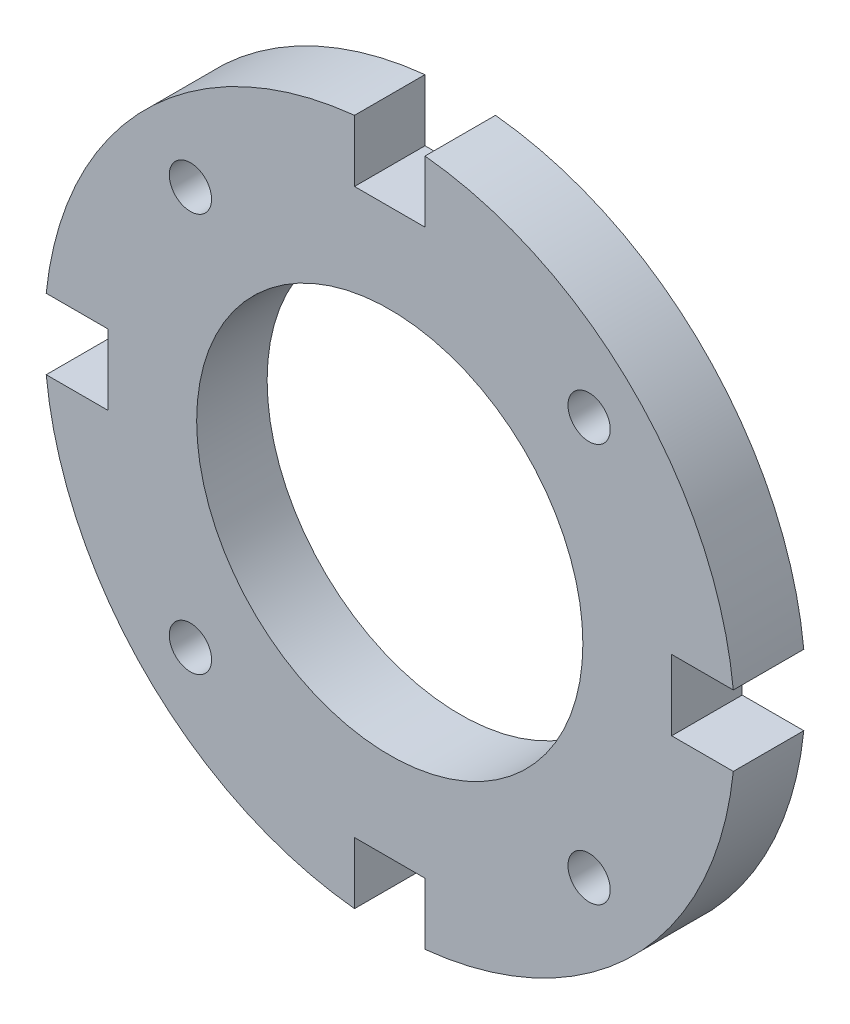
ISO-10303-21;
HEADER;
FILE_DESCRIPTION(('STEP AP214'),'2;1');
FILE_NAME('part.step','',(''),(''),'','','');
FILE_SCHEMA(('AUTOMOTIVE_DESIGN { 1 0 10303 214 1 1 1 1 }'));
ENDSEC;
DATA;
#1=APPLICATION_CONTEXT('core data for automotive mechanical design processes');
#2=APPLICATION_PROTOCOL_DEFINITION('international standard','automotive_design',2000,#1);
#3=PRODUCT_CONTEXT('',#1,'mechanical');
#4=PRODUCT('Part','Part','',(#3));
#5=PRODUCT_RELATED_PRODUCT_CATEGORY('part','',(#4));
#6=PRODUCT_DEFINITION_FORMATION('','',#4);
#7=PRODUCT_DEFINITION_CONTEXT('part definition',#1,'design');
#8=PRODUCT_DEFINITION('design','',#6,#7);
#9=PRODUCT_DEFINITION_SHAPE('','',#8);
#10=(LENGTH_UNIT() NAMED_UNIT(*) SI_UNIT(.MILLI.,.METRE.));
#11=(NAMED_UNIT(*) PLANE_ANGLE_UNIT() SI_UNIT($,.RADIAN.));
#12=(NAMED_UNIT(*) SI_UNIT($,.STERADIAN.) SOLID_ANGLE_UNIT());
#13=UNCERTAINTY_MEASURE_WITH_UNIT(LENGTH_MEASURE(1.E-05),#10,'distance_accuracy_value','');
#14=(GEOMETRIC_REPRESENTATION_CONTEXT(3) GLOBAL_UNCERTAINTY_ASSIGNED_CONTEXT((#13)) GLOBAL_UNIT_ASSIGNED_CONTEXT((#10,
#11,#12)) REPRESENTATION_CONTEXT('',''));
#15=CARTESIAN_POINT('',(0.,0.,0.));
#16=DIRECTION('',(0.,0.,1.));
#17=DIRECTION('',(1.,0.,0.));
#18=AXIS2_PLACEMENT_3D('',#15,#16,#17);
#19=CARTESIAN_POINT('',(0.,0.,5.));
#20=DIRECTION('',(0.,0.,1.));
#21=DIRECTION('',(1.,0.,0.));
#22=AXIS2_PLACEMENT_3D('',#19,#20,#21);
#23=PLANE('',#22);
#24=CARTESIAN_POINT('',(-14.1421356237309,14.142135623731,5.));
#25=DIRECTION('',(0.,0.,1.));
#26=DIRECTION('',(-1.,0.,0.));
#27=AXIS2_PLACEMENT_3D('',#24,#25,#26);
#28=CIRCLE('',#27,1.5);
#29=CARTESIAN_POINT('',(-15.6421356237309,14.142135623731,5.));
#30=VERTEX_POINT('',#29);
#31=EDGE_CURVE('E346',#30,#30,#28,.T.);
#32=ORIENTED_EDGE('',*,*,#31,.F.);
#33=EDGE_LOOP('',(#32));
#34=FACE_BOUND('',#33,.T.);
#35=CARTESIAN_POINT('',(14.1421356237309,14.142135623731,5.));
#36=DIRECTION('',(0.,0.,1.));
#37=DIRECTION('',(1.,0.,0.));
#38=AXIS2_PLACEMENT_3D('',#35,#36,#37);
#39=CIRCLE('',#38,1.5);
#40=CARTESIAN_POINT('',(15.6421356237309,14.142135623731,5.));
#41=VERTEX_POINT('',#40);
#42=EDGE_CURVE('E358',#41,#41,#39,.T.);
#43=ORIENTED_EDGE('',*,*,#42,.F.);
#44=EDGE_LOOP('',(#43));
#45=FACE_BOUND('',#44,.T.);
#46=CARTESIAN_POINT('',(0.,0.,5.));
#47=DIRECTION('',(0.,0.,1.));
#48=DIRECTION('',(1.,0.,0.));
#49=AXIS2_PLACEMENT_3D('',#46,#47,#48);
#50=CIRCLE('',#49,24.5000000000001);
#51=CARTESIAN_POINT('',(-2.5,24.3721152139079,5.));
#52=VERTEX_POINT('',#51);
#53=CARTESIAN_POINT('',(-24.3721152139079,2.49999999999999,5.));
#54=VERTEX_POINT('',#53);
#55=EDGE_CURVE('E208',#52,#54,#50,.T.);
#56=ORIENTED_EDGE('',*,*,#55,.T.);
#57=DIRECTION('',(1.,0.,0.));
#58=VECTOR('',#57,1.);
#59=CARTESIAN_POINT('',(-24.3721152139079,2.49999999999999,5.));
#60=LINE('',#59,#58);
#61=CARTESIAN_POINT('',(-20.,2.49999999999999,5.));
#62=VERTEX_POINT('',#61);
#63=EDGE_CURVE('E116',#54,#62,#60,.T.);
#64=ORIENTED_EDGE('',*,*,#63,.T.);
#65=DIRECTION('',(0.,-1.,0.));
#66=VECTOR('',#65,1.);
#67=CARTESIAN_POINT('',(-20.,2.49999999999999,5.));
#68=LINE('',#67,#66);
#69=CARTESIAN_POINT('',(-20.,-2.49999999999999,5.));
#70=VERTEX_POINT('',#69);
#71=EDGE_CURVE('E247',#62,#70,#68,.T.);
#72=ORIENTED_EDGE('',*,*,#71,.T.);
#73=DIRECTION('',(-1.,0.,0.));
#74=VECTOR('',#73,1.);
#75=CARTESIAN_POINT('',(-20.,-2.49999999999999,5.));
#76=LINE('',#75,#74);
#77=CARTESIAN_POINT('',(-24.3721152139079,-2.49999999999999,5.));
#78=VERTEX_POINT('',#77);
#79=EDGE_CURVE('E266',#70,#78,#76,.T.);
#80=ORIENTED_EDGE('',*,*,#79,.T.);
#81=CARTESIAN_POINT('',(0.,0.,5.));
#82=DIRECTION('',(0.,0.,1.));
#83=DIRECTION('',(1.,0.,0.));
#84=AXIS2_PLACEMENT_3D('',#81,#82,#83);
#85=CIRCLE('',#84,24.5);
#86=CARTESIAN_POINT('',(-2.50000000000001,-24.3721152139079,5.));
#87=VERTEX_POINT('',#86);
#88=EDGE_CURVE('E263',#78,#87,#85,.T.);
#89=ORIENTED_EDGE('',*,*,#88,.T.);
#90=DIRECTION('',(0.,1.,0.));
#91=VECTOR('',#90,1.);
#92=CARTESIAN_POINT('',(-2.5,-24.3721152139079,5.));
#93=LINE('',#92,#91);
#94=CARTESIAN_POINT('',(-2.5,-20.,5.));
#95=VERTEX_POINT('',#94);
#96=EDGE_CURVE('E265',#87,#95,#93,.T.);
#97=ORIENTED_EDGE('',*,*,#96,.T.);
#98=DIRECTION('',(1.,0.,0.));
#99=VECTOR('',#98,1.);
#100=CARTESIAN_POINT('',(-2.5,-20.,5.));
#101=LINE('',#100,#99);
#102=CARTESIAN_POINT('',(2.5,-20.,5.));
#103=VERTEX_POINT('',#102);
#104=EDGE_CURVE('E268',#95,#103,#101,.T.);
#105=ORIENTED_EDGE('',*,*,#104,.T.);
#106=DIRECTION('',(0.,-1.,0.));
#107=VECTOR('',#106,1.);
#108=CARTESIAN_POINT('',(2.5,-20.,5.));
#109=LINE('',#108,#107);
#110=CARTESIAN_POINT('',(2.5,-24.3721152139079,5.));
#111=VERTEX_POINT('',#110);
#112=EDGE_CURVE('E274',#103,#111,#109,.T.);
#113=ORIENTED_EDGE('',*,*,#112,.T.);
#114=CARTESIAN_POINT('',(0.,0.,5.));
#115=DIRECTION('',(0.,0.,1.));
#116=DIRECTION('',(1.,0.,0.));
#117=AXIS2_PLACEMENT_3D('',#114,#115,#116);
#118=CIRCLE('',#117,24.5);
#119=CARTESIAN_POINT('',(24.3721152139079,-2.49999999999999,5.));
#120=VERTEX_POINT('',#119);
#121=EDGE_CURVE('E276',#111,#120,#118,.T.);
#122=ORIENTED_EDGE('',*,*,#121,.T.);
#123=DIRECTION('',(-1.,0.,0.));
#124=VECTOR('',#123,1.);
#125=CARTESIAN_POINT('',(20.,-2.49999999999999,5.));
#126=LINE('',#125,#124);
#127=CARTESIAN_POINT('',(20.,-2.49999999999999,5.));
#128=VERTEX_POINT('',#127);
#129=EDGE_CURVE('E278',#120,#128,#126,.T.);
#130=ORIENTED_EDGE('',*,*,#129,.T.);
#131=DIRECTION('',(0.,1.,0.));
#132=VECTOR('',#131,1.);
#133=CARTESIAN_POINT('',(20.,2.49999999999999,5.));
#134=LINE('',#133,#132);
#135=CARTESIAN_POINT('',(20.,2.49999999999999,5.));
#136=VERTEX_POINT('',#135);
#137=EDGE_CURVE('E280',#128,#136,#134,.T.);
#138=ORIENTED_EDGE('',*,*,#137,.T.);
#139=DIRECTION('',(1.,0.,0.));
#140=VECTOR('',#139,1.);
#141=CARTESIAN_POINT('',(24.3721152139079,2.49999999999999,5.));
#142=LINE('',#141,#140);
#143=CARTESIAN_POINT('',(24.3721152139079,2.49999999999999,5.));
#144=VERTEX_POINT('',#143);
#145=EDGE_CURVE('E282',#136,#144,#142,.T.);
#146=ORIENTED_EDGE('',*,*,#145,.T.);
#147=CARTESIAN_POINT('',(0.,0.,5.));
#148=DIRECTION('',(0.,0.,1.));
#149=DIRECTION('',(-1.,0.,0.));
#150=AXIS2_PLACEMENT_3D('',#147,#148,#149);
#151=CIRCLE('',#150,24.5);
#152=CARTESIAN_POINT('',(2.5,24.3721152139079,5.));
#153=VERTEX_POINT('',#152);
#154=EDGE_CURVE('E159',#144,#153,#151,.T.);
#155=ORIENTED_EDGE('',*,*,#154,.T.);
#156=DIRECTION('',(0.,-1.,0.));
#157=VECTOR('',#156,1.);
#158=CARTESIAN_POINT('',(2.5,24.3721152139079,5.));
#159=LINE('',#158,#157);
#160=CARTESIAN_POINT('',(2.5,20.,5.));
#161=VERTEX_POINT('',#160);
#162=EDGE_CURVE('E153',#153,#161,#159,.T.);
#163=ORIENTED_EDGE('',*,*,#162,.T.);
#164=DIRECTION('',(-1.,0.,0.));
#165=VECTOR('',#164,1.);
#166=CARTESIAN_POINT('',(2.5,20.,5.));
#167=LINE('',#166,#165);
#168=CARTESIAN_POINT('',(-2.5,20.,5.));
#169=VERTEX_POINT('',#168);
#170=EDGE_CURVE('E157',#161,#169,#167,.T.);
#171=ORIENTED_EDGE('',*,*,#170,.T.);
#172=DIRECTION('',(0.,1.,0.));
#173=VECTOR('',#172,1.);
#174=CARTESIAN_POINT('',(-2.5,20.,5.));
#175=LINE('',#174,#173);
#176=EDGE_CURVE('E49',#169,#52,#175,.T.);
#177=ORIENTED_EDGE('',*,*,#176,.T.);
#178=EDGE_LOOP('',(#56,#64,#72,#80,#89,#97,#105,#113,#122,#130,#138,#146,#155,#163,#171,#177));
#179=FACE_BOUND('',#178,.T.);
#180=CARTESIAN_POINT('',(0.,0.,5.));
#181=DIRECTION('',(0.,0.,1.));
#182=DIRECTION('',(1.,0.,0.));
#183=AXIS2_PLACEMENT_3D('',#180,#181,#182);
#184=CIRCLE('',#183,13.7);
#185=CARTESIAN_POINT('',(13.7,0.,5.));
#186=VERTEX_POINT('',#185);
#187=EDGE_CURVE('E181',#186,#186,#184,.T.);
#188=ORIENTED_EDGE('',*,*,#187,.F.);
#189=EDGE_LOOP('',(#188));
#190=FACE_BOUND('',#189,.T.);
#191=CARTESIAN_POINT('',(14.1421356237309,-14.142135623731,5.));
#192=DIRECTION('',(0.,0.,1.));
#193=DIRECTION('',(-1.,0.,0.));
#194=AXIS2_PLACEMENT_3D('',#191,#192,#193);
#195=CIRCLE('',#194,1.5);
#196=CARTESIAN_POINT('',(12.6421356237309,-14.142135623731,5.));
#197=VERTEX_POINT('',#196);
#198=EDGE_CURVE('E352',#197,#197,#195,.T.);
#199=ORIENTED_EDGE('',*,*,#198,.F.);
#200=EDGE_LOOP('',(#199));
#201=FACE_BOUND('',#200,.T.);
#202=CARTESIAN_POINT('',(-14.1421356237309,-14.142135623731,5.));
#203=DIRECTION('',(0.,0.,1.));
#204=DIRECTION('',(1.,0.,0.));
#205=AXIS2_PLACEMENT_3D('',#202,#203,#204);
#206=CIRCLE('',#205,1.5);
#207=CARTESIAN_POINT('',(-12.6421356237309,-14.142135623731,5.));
#208=VERTEX_POINT('',#207);
#209=EDGE_CURVE('E337',#208,#208,#206,.T.);
#210=ORIENTED_EDGE('',*,*,#209,.F.);
#211=EDGE_LOOP('',(#210));
#212=FACE_BOUND('',#211,.T.);
#213=ADVANCED_FACE('F32',(#34,#45,#179,#190,#201,#212),#23,.T.);
#214=CARTESIAN_POINT('',(0.,0.,0.));
#215=DIRECTION('',(0.,0.,1.));
#216=DIRECTION('',(1.,0.,0.));
#217=AXIS2_PLACEMENT_3D('',#214,#215,#216);
#218=PLANE('',#217);
#219=CARTESIAN_POINT('',(0.,0.,0.));
#220=DIRECTION('',(0.,0.,1.));
#221=DIRECTION('',(1.,0.,0.));
#222=AXIS2_PLACEMENT_3D('',#219,#220,#221);
#223=CIRCLE('',#222,24.5000000000001);
#224=CARTESIAN_POINT('',(-2.5,24.3721152139079,0.));
#225=VERTEX_POINT('',#224);
#226=CARTESIAN_POINT('',(-24.3721152139079,2.49999999999999,0.));
#227=VERTEX_POINT('',#226);
#228=EDGE_CURVE('E177',#225,#227,#223,.T.);
#229=ORIENTED_EDGE('',*,*,#228,.F.);
#230=DIRECTION('',(0.,1.,0.));
#231=VECTOR('',#230,1.);
#232=CARTESIAN_POINT('',(-2.5,20.,0.));
#233=LINE('',#232,#231);
#234=CARTESIAN_POINT('',(-2.5,20.,0.));
#235=VERTEX_POINT('',#234);
#236=EDGE_CURVE('E108',#235,#225,#233,.T.);
#237=ORIENTED_EDGE('',*,*,#236,.F.);
#238=DIRECTION('',(-1.,0.,0.));
#239=VECTOR('',#238,1.);
#240=CARTESIAN_POINT('',(2.5,20.,0.));
#241=LINE('',#240,#239);
#242=CARTESIAN_POINT('',(2.5,20.,0.));
#243=VERTEX_POINT('',#242);
#244=EDGE_CURVE('E102',#243,#235,#241,.T.);
#245=ORIENTED_EDGE('',*,*,#244,.F.);
#246=DIRECTION('',(0.,-1.,0.));
#247=VECTOR('',#246,1.);
#248=CARTESIAN_POINT('',(2.5,24.3721152139079,0.));
#249=LINE('',#248,#247);
#250=CARTESIAN_POINT('',(2.5,24.3721152139079,0.));
#251=VERTEX_POINT('',#250);
#252=EDGE_CURVE('E167',#251,#243,#249,.T.);
#253=ORIENTED_EDGE('',*,*,#252,.F.);
#254=CARTESIAN_POINT('',(0.,0.,0.));
#255=DIRECTION('',(0.,0.,1.));
#256=DIRECTION('',(-1.,0.,0.));
#257=AXIS2_PLACEMENT_3D('',#254,#255,#256);
#258=CIRCLE('',#257,24.5);
#259=CARTESIAN_POINT('',(24.3721152139079,2.49999999999999,0.));
#260=VERTEX_POINT('',#259);
#261=EDGE_CURVE('E203',#260,#251,#258,.T.);
#262=ORIENTED_EDGE('',*,*,#261,.F.);
#263=DIRECTION('',(1.,0.,0.));
#264=VECTOR('',#263,1.);
#265=CARTESIAN_POINT('',(24.3721152139079,2.49999999999999,0.));
#266=LINE('',#265,#264);
#267=CARTESIAN_POINT('',(20.,2.49999999999999,0.));
#268=VERTEX_POINT('',#267);
#269=EDGE_CURVE('E201',#268,#260,#266,.T.);
#270=ORIENTED_EDGE('',*,*,#269,.F.);
#271=DIRECTION('',(0.,1.,0.));
#272=VECTOR('',#271,1.);
#273=CARTESIAN_POINT('',(20.,2.49999999999999,0.));
#274=LINE('',#273,#272);
#275=CARTESIAN_POINT('',(20.,-2.49999999999999,0.));
#276=VERTEX_POINT('',#275);
#277=EDGE_CURVE('E199',#276,#268,#274,.T.);
#278=ORIENTED_EDGE('',*,*,#277,.F.);
#279=DIRECTION('',(-1.,0.,0.));
#280=VECTOR('',#279,1.);
#281=CARTESIAN_POINT('',(20.,-2.49999999999999,0.));
#282=LINE('',#281,#280);
#283=CARTESIAN_POINT('',(24.3721152139079,-2.49999999999999,0.));
#284=VERTEX_POINT('',#283);
#285=EDGE_CURVE('E197',#284,#276,#282,.T.);
#286=ORIENTED_EDGE('',*,*,#285,.F.);
#287=CARTESIAN_POINT('',(0.,0.,0.));
#288=DIRECTION('',(0.,0.,1.));
#289=DIRECTION('',(1.,0.,0.));
#290=AXIS2_PLACEMENT_3D('',#287,#288,#289);
#291=CIRCLE('',#290,24.5);
#292=CARTESIAN_POINT('',(2.5,-24.3721152139079,0.));
#293=VERTEX_POINT('',#292);
#294=EDGE_CURVE('E195',#293,#284,#291,.T.);
#295=ORIENTED_EDGE('',*,*,#294,.F.);
#296=DIRECTION('',(0.,-1.,0.));
#297=VECTOR('',#296,1.);
#298=CARTESIAN_POINT('',(2.5,-20.,0.));
#299=LINE('',#298,#297);
#300=CARTESIAN_POINT('',(2.5,-20.,0.));
#301=VERTEX_POINT('',#300);
#302=EDGE_CURVE('E193',#301,#293,#299,.T.);
#303=ORIENTED_EDGE('',*,*,#302,.F.);
#304=DIRECTION('',(1.,0.,0.));
#305=VECTOR('',#304,1.);
#306=CARTESIAN_POINT('',(-2.5,-20.,0.));
#307=LINE('',#306,#305);
#308=CARTESIAN_POINT('',(-2.5,-20.,0.));
#309=VERTEX_POINT('',#308);
#310=EDGE_CURVE('E191',#309,#301,#307,.T.);
#311=ORIENTED_EDGE('',*,*,#310,.F.);
#312=DIRECTION('',(0.,1.,0.));
#313=VECTOR('',#312,1.);
#314=CARTESIAN_POINT('',(-2.5,-24.3721152139079,0.));
#315=LINE('',#314,#313);
#316=CARTESIAN_POINT('',(-2.50000000000001,-24.3721152139079,0.));
#317=VERTEX_POINT('',#316);
#318=EDGE_CURVE('E189',#317,#309,#315,.T.);
#319=ORIENTED_EDGE('',*,*,#318,.F.);
#320=CARTESIAN_POINT('',(0.,0.,0.));
#321=DIRECTION('',(0.,0.,1.));
#322=DIRECTION('',(1.,0.,0.));
#323=AXIS2_PLACEMENT_3D('',#320,#321,#322);
#324=CIRCLE('',#323,24.5);
#325=CARTESIAN_POINT('',(-24.3721152139079,-2.49999999999999,0.));
#326=VERTEX_POINT('',#325);
#327=EDGE_CURVE('E187',#326,#317,#324,.T.);
#328=ORIENTED_EDGE('',*,*,#327,.F.);
#329=DIRECTION('',(-1.,0.,0.));
#330=VECTOR('',#329,1.);
#331=CARTESIAN_POINT('',(-20.,-2.49999999999999,0.));
#332=LINE('',#331,#330);
#333=CARTESIAN_POINT('',(-20.,-2.49999999999999,0.));
#334=VERTEX_POINT('',#333);
#335=EDGE_CURVE('E185',#334,#326,#332,.T.);
#336=ORIENTED_EDGE('',*,*,#335,.F.);
#337=DIRECTION('',(0.,-1.,0.));
#338=VECTOR('',#337,1.);
#339=CARTESIAN_POINT('',(-20.,2.49999999999999,0.));
#340=LINE('',#339,#338);
#341=CARTESIAN_POINT('',(-20.,2.49999999999999,0.));
#342=VERTEX_POINT('',#341);
#343=EDGE_CURVE('E183',#342,#334,#340,.T.);
#344=ORIENTED_EDGE('',*,*,#343,.F.);
#345=DIRECTION('',(1.,0.,0.));
#346=VECTOR('',#345,1.);
#347=CARTESIAN_POINT('',(-24.3721152139079,2.49999999999999,0.));
#348=LINE('',#347,#346);
#349=EDGE_CURVE('E180',#227,#342,#348,.T.);
#350=ORIENTED_EDGE('',*,*,#349,.F.);
#351=EDGE_LOOP('',(#229,#237,#245,#253,#262,#270,#278,#286,#295,#303,#311,#319,#328,#336,#344,#350));
#352=FACE_BOUND('',#351,.T.);
#353=CARTESIAN_POINT('',(0.,0.,0.));
#354=DIRECTION('',(0.,0.,1.));
#355=DIRECTION('',(1.,0.,0.));
#356=AXIS2_PLACEMENT_3D('',#353,#354,#355);
#357=CIRCLE('',#356,13.7);
#358=CARTESIAN_POINT('',(13.7,0.,0.));
#359=VERTEX_POINT('',#358);
#360=EDGE_CURVE('E361',#359,#359,#357,.T.);
#361=ORIENTED_EDGE('',*,*,#360,.T.);
#362=EDGE_LOOP('',(#361));
#363=FACE_BOUND('',#362,.T.);
#364=CARTESIAN_POINT('',(14.1421356237309,14.142135623731,0.));
#365=DIRECTION('',(0.,0.,1.));
#366=DIRECTION('',(1.,0.,0.));
#367=AXIS2_PLACEMENT_3D('',#364,#365,#366);
#368=CIRCLE('',#367,1.5);
#369=CARTESIAN_POINT('',(15.6421356237309,14.142135623731,0.));
#370=VERTEX_POINT('',#369);
#371=EDGE_CURVE('E355',#370,#370,#368,.T.);
#372=ORIENTED_EDGE('',*,*,#371,.T.);
#373=EDGE_LOOP('',(#372));
#374=FACE_BOUND('',#373,.T.);
#375=CARTESIAN_POINT('',(14.1421356237309,-14.142135623731,0.));
#376=DIRECTION('',(0.,0.,1.));
#377=DIRECTION('',(-1.,0.,0.));
#378=AXIS2_PLACEMENT_3D('',#375,#376,#377);
#379=CIRCLE('',#378,1.5);
#380=CARTESIAN_POINT('',(12.6421356237309,-14.142135623731,0.));
#381=VERTEX_POINT('',#380);
#382=EDGE_CURVE('E349',#381,#381,#379,.T.);
#383=ORIENTED_EDGE('',*,*,#382,.T.);
#384=EDGE_LOOP('',(#383));
#385=FACE_BOUND('',#384,.T.);
#386=CARTESIAN_POINT('',(-14.1421356237309,14.142135623731,0.));
#387=DIRECTION('',(0.,0.,1.));
#388=DIRECTION('',(-1.,0.,0.));
#389=AXIS2_PLACEMENT_3D('',#386,#387,#388);
#390=CIRCLE('',#389,1.5);
#391=CARTESIAN_POINT('',(-15.6421356237309,14.142135623731,0.));
#392=VERTEX_POINT('',#391);
#393=EDGE_CURVE('E343',#392,#392,#390,.T.);
#394=ORIENTED_EDGE('',*,*,#393,.T.);
#395=EDGE_LOOP('',(#394));
#396=FACE_BOUND('',#395,.T.);
#397=CARTESIAN_POINT('',(-14.1421356237309,-14.142135623731,0.));
#398=DIRECTION('',(0.,0.,1.));
#399=DIRECTION('',(1.,0.,0.));
#400=AXIS2_PLACEMENT_3D('',#397,#398,#399);
#401=CIRCLE('',#400,1.5);
#402=CARTESIAN_POINT('',(-12.6421356237309,-14.142135623731,0.));
#403=VERTEX_POINT('',#402);
#404=EDGE_CURVE('E340',#403,#403,#401,.T.);
#405=ORIENTED_EDGE('',*,*,#404,.T.);
#406=EDGE_LOOP('',(#405));
#407=FACE_BOUND('',#406,.T.);
#408=ADVANCED_FACE('F251',(#352,#363,#374,#385,#396,#407),#218,.F.);
#409=CARTESIAN_POINT('',(0.,0.,5.));
#410=DIRECTION('',(0.,0.,-1.));
#411=DIRECTION('',(-1.,0.,0.));
#412=AXIS2_PLACEMENT_3D('',#409,#410,#411);
#413=CYLINDRICAL_SURFACE('',#412,24.5000000000001);
#414=ORIENTED_EDGE('',*,*,#228,.T.);
#415=DIRECTION('',(0.,0.,-1.));
#416=VECTOR('',#415,1.);
#417=CARTESIAN_POINT('',(-24.3721152139079,2.49999999999999,5.));
#418=LINE('',#417,#416);
#419=EDGE_CURVE('E11',#54,#227,#418,.T.);
#420=ORIENTED_EDGE('',*,*,#419,.F.);
#421=ORIENTED_EDGE('',*,*,#55,.F.);
#422=DIRECTION('',(0.,0.,-1.));
#423=VECTOR('',#422,1.);
#424=CARTESIAN_POINT('',(-2.5,24.3721152139079,5.));
#425=LINE('',#424,#423);
#426=EDGE_CURVE('E173',#52,#225,#425,.T.);
#427=ORIENTED_EDGE('',*,*,#426,.T.);
#428=EDGE_LOOP('',(#414,#420,#421,#427));
#429=FACE_BOUND('',#428,.T.);
#430=ADVANCED_FACE('F34',(#429),#413,.T.);
#431=CARTESIAN_POINT('',(-24.3721152139079,2.49999999999999,5.));
#432=DIRECTION('',(0.,1.,0.));
#433=DIRECTION('',(-1.,0.,0.));
#434=AXIS2_PLACEMENT_3D('',#431,#432,#433);
#435=PLANE('',#434);
#436=ORIENTED_EDGE('',*,*,#349,.T.);
#437=DIRECTION('',(0.,0.,-1.));
#438=VECTOR('',#437,1.);
#439=CARTESIAN_POINT('',(-20.,2.49999999999999,5.));
#440=LINE('',#439,#438);
#441=EDGE_CURVE('E41',#62,#342,#440,.T.);
#442=ORIENTED_EDGE('',*,*,#441,.F.);
#443=ORIENTED_EDGE('',*,*,#63,.F.);
#444=ORIENTED_EDGE('',*,*,#419,.T.);
#445=EDGE_LOOP('',(#436,#442,#443,#444));
#446=FACE_BOUND('',#445,.T.);
#447=ADVANCED_FACE('F520',(#446),#435,.F.);
#448=CARTESIAN_POINT('',(-20.,2.49999999999999,5.));
#449=DIRECTION('',(1.,0.,0.));
#450=DIRECTION('',(0.,0.,-1.));
#451=AXIS2_PLACEMENT_3D('',#448,#449,#450);
#452=PLANE('',#451);
#453=ORIENTED_EDGE('',*,*,#343,.T.);
#454=DIRECTION('',(0.,0.,-1.));
#455=VECTOR('',#454,1.);
#456=CARTESIAN_POINT('',(-20.,-2.49999999999999,5.));
#457=LINE('',#456,#455);
#458=EDGE_CURVE('E239',#70,#334,#457,.T.);
#459=ORIENTED_EDGE('',*,*,#458,.F.);
#460=ORIENTED_EDGE('',*,*,#71,.F.);
#461=ORIENTED_EDGE('',*,*,#441,.T.);
#462=EDGE_LOOP('',(#453,#459,#460,#461));
#463=FACE_BOUND('',#462,.T.);
#464=ADVANCED_FACE('F245',(#463),#452,.F.);
#465=CARTESIAN_POINT('',(-20.,-2.49999999999999,5.));
#466=DIRECTION('',(0.,-1.,0.));
#467=DIRECTION('',(1.,0.,0.));
#468=AXIS2_PLACEMENT_3D('',#465,#466,#467);
#469=PLANE('',#468);
#470=ORIENTED_EDGE('',*,*,#335,.T.);
#471=DIRECTION('',(0.,0.,-1.));
#472=VECTOR('',#471,1.);
#473=CARTESIAN_POINT('',(-24.3721152139079,-2.49999999999999,5.));
#474=LINE('',#473,#472);
#475=EDGE_CURVE('E236',#78,#326,#474,.T.);
#476=ORIENTED_EDGE('',*,*,#475,.F.);
#477=ORIENTED_EDGE('',*,*,#79,.F.);
#478=ORIENTED_EDGE('',*,*,#458,.T.);
#479=EDGE_LOOP('',(#470,#476,#477,#478));
#480=FACE_BOUND('',#479,.T.);
#481=ADVANCED_FACE('F257',(#480),#469,.F.);
#482=CARTESIAN_POINT('',(0.,0.,5.));
#483=DIRECTION('',(0.,0.,-1.));
#484=DIRECTION('',(-1.,0.,0.));
#485=AXIS2_PLACEMENT_3D('',#482,#483,#484);
#486=CYLINDRICAL_SURFACE('',#485,24.5);
#487=ORIENTED_EDGE('',*,*,#327,.T.);
#488=DIRECTION('',(0.,0.,-1.));
#489=VECTOR('',#488,1.);
#490=CARTESIAN_POINT('',(-2.50000000000001,-24.3721152139079,5.));
#491=LINE('',#490,#489);
#492=EDGE_CURVE('E233',#87,#317,#491,.T.);
#493=ORIENTED_EDGE('',*,*,#492,.F.);
#494=ORIENTED_EDGE('',*,*,#88,.F.);
#495=ORIENTED_EDGE('',*,*,#475,.T.);
#496=EDGE_LOOP('',(#487,#493,#494,#495));
#497=FACE_BOUND('',#496,.T.);
#498=ADVANCED_FACE('F261',(#497),#486,.T.);
#499=CARTESIAN_POINT('',(-2.5,-24.3721152139079,5.));
#500=DIRECTION('',(-1.,0.,0.));
#501=DIRECTION('',(0.,-1.,0.));
#502=AXIS2_PLACEMENT_3D('',#499,#500,#501);
#503=PLANE('',#502);
#504=ORIENTED_EDGE('',*,*,#318,.T.);
#505=DIRECTION('',(0.,0.,-1.));
#506=VECTOR('',#505,1.);
#507=CARTESIAN_POINT('',(-2.5,-20.,5.));
#508=LINE('',#507,#506);
#509=EDGE_CURVE('E230',#95,#309,#508,.T.);
#510=ORIENTED_EDGE('',*,*,#509,.F.);
#511=ORIENTED_EDGE('',*,*,#96,.F.);
#512=ORIENTED_EDGE('',*,*,#492,.T.);
#513=EDGE_LOOP('',(#504,#510,#511,#512));
#514=FACE_BOUND('',#513,.T.);
#515=ADVANCED_FACE('F485',(#514),#503,.F.);
#516=CARTESIAN_POINT('',(-2.5,-20.,5.));
#517=DIRECTION('',(0.,1.,0.));
#518=DIRECTION('',(0.,0.,1.));
#519=AXIS2_PLACEMENT_3D('',#516,#517,#518);
#520=PLANE('',#519);
#521=ORIENTED_EDGE('',*,*,#310,.T.);
#522=DIRECTION('',(0.,0.,-1.));
#523=VECTOR('',#522,1.);
#524=CARTESIAN_POINT('',(2.5,-20.,5.));
#525=LINE('',#524,#523);
#526=EDGE_CURVE('E227',#103,#301,#525,.T.);
#527=ORIENTED_EDGE('',*,*,#526,.F.);
#528=ORIENTED_EDGE('',*,*,#104,.F.);
#529=ORIENTED_EDGE('',*,*,#509,.T.);
#530=EDGE_LOOP('',(#521,#527,#528,#529));
#531=FACE_BOUND('',#530,.T.);
#532=ADVANCED_FACE('F475',(#531),#520,.F.);
#533=CARTESIAN_POINT('',(2.5,-20.,5.));
#534=DIRECTION('',(1.,0.,0.));
#535=DIRECTION('',(0.,1.,0.));
#536=AXIS2_PLACEMENT_3D('',#533,#534,#535);
#537=PLANE('',#536);
#538=ORIENTED_EDGE('',*,*,#302,.T.);
#539=DIRECTION('',(0.,0.,-1.));
#540=VECTOR('',#539,1.);
#541=CARTESIAN_POINT('',(2.5,-24.3721152139079,5.));
#542=LINE('',#541,#540);
#543=EDGE_CURVE('E224',#111,#293,#542,.T.);
#544=ORIENTED_EDGE('',*,*,#543,.F.);
#545=ORIENTED_EDGE('',*,*,#112,.F.);
#546=ORIENTED_EDGE('',*,*,#526,.T.);
#547=EDGE_LOOP('',(#538,#544,#545,#546));
#548=FACE_BOUND('',#547,.T.);
#549=ADVANCED_FACE('F465',(#548),#537,.F.);
#550=CARTESIAN_POINT('',(0.,0.,5.));
#551=DIRECTION('',(0.,0.,-1.));
#552=DIRECTION('',(-1.,0.,0.));
#553=AXIS2_PLACEMENT_3D('',#550,#551,#552);
#554=CYLINDRICAL_SURFACE('',#553,24.5);
#555=ORIENTED_EDGE('',*,*,#294,.T.);
#556=DIRECTION('',(0.,0.,-1.));
#557=VECTOR('',#556,1.);
#558=CARTESIAN_POINT('',(24.3721152139079,-2.49999999999999,5.));
#559=LINE('',#558,#557);
#560=EDGE_CURVE('E221',#120,#284,#559,.T.);
#561=ORIENTED_EDGE('',*,*,#560,.F.);
#562=ORIENTED_EDGE('',*,*,#121,.F.);
#563=ORIENTED_EDGE('',*,*,#543,.T.);
#564=EDGE_LOOP('',(#555,#561,#562,#563));
#565=FACE_BOUND('',#564,.T.);
#566=ADVANCED_FACE('F455',(#565),#554,.T.);
#567=CARTESIAN_POINT('',(20.,-2.49999999999999,5.));
#568=DIRECTION('',(0.,-1.,0.));
#569=DIRECTION('',(1.,0.,0.));
#570=AXIS2_PLACEMENT_3D('',#567,#568,#569);
#571=PLANE('',#570);
#572=ORIENTED_EDGE('',*,*,#285,.T.);
#573=DIRECTION('',(0.,0.,-1.));
#574=VECTOR('',#573,1.);
#575=CARTESIAN_POINT('',(20.,-2.49999999999999,5.));
#576=LINE('',#575,#574);
#577=EDGE_CURVE('E218',#128,#276,#576,.T.);
#578=ORIENTED_EDGE('',*,*,#577,.F.);
#579=ORIENTED_EDGE('',*,*,#129,.F.);
#580=ORIENTED_EDGE('',*,*,#560,.T.);
#581=EDGE_LOOP('',(#572,#578,#579,#580));
#582=FACE_BOUND('',#581,.T.);
#583=ADVANCED_FACE('F445',(#582),#571,.F.);
#584=CARTESIAN_POINT('',(20.,2.49999999999999,5.));
#585=DIRECTION('',(-1.,0.,0.));
#586=DIRECTION('',(0.,0.,1.));
#587=AXIS2_PLACEMENT_3D('',#584,#585,#586);
#588=PLANE('',#587);
#589=ORIENTED_EDGE('',*,*,#277,.T.);
#590=DIRECTION('',(0.,0.,-1.));
#591=VECTOR('',#590,1.);
#592=CARTESIAN_POINT('',(20.,2.49999999999999,5.));
#593=LINE('',#592,#591);
#594=EDGE_CURVE('E215',#136,#268,#593,.T.);
#595=ORIENTED_EDGE('',*,*,#594,.F.);
#596=ORIENTED_EDGE('',*,*,#137,.F.);
#597=ORIENTED_EDGE('',*,*,#577,.T.);
#598=EDGE_LOOP('',(#589,#595,#596,#597));
#599=FACE_BOUND('',#598,.T.);
#600=ADVANCED_FACE('F436',(#599),#588,.F.);
#601=CARTESIAN_POINT('',(24.3721152139079,2.49999999999999,5.));
#602=DIRECTION('',(0.,1.,0.));
#603=DIRECTION('',(-1.,0.,0.));
#604=AXIS2_PLACEMENT_3D('',#601,#602,#603);
#605=PLANE('',#604);
#606=ORIENTED_EDGE('',*,*,#269,.T.);
#607=DIRECTION('',(0.,0.,-1.));
#608=VECTOR('',#607,1.);
#609=CARTESIAN_POINT('',(24.3721152139079,2.49999999999999,5.));
#610=LINE('',#609,#608);
#611=EDGE_CURVE('E212',#144,#260,#610,.T.);
#612=ORIENTED_EDGE('',*,*,#611,.F.);
#613=ORIENTED_EDGE('',*,*,#145,.F.);
#614=ORIENTED_EDGE('',*,*,#594,.T.);
#615=EDGE_LOOP('',(#606,#612,#613,#614));
#616=FACE_BOUND('',#615,.T.);
#617=ADVANCED_FACE('F288',(#616),#605,.F.);
#618=CARTESIAN_POINT('',(0.,0.,5.));
#619=DIRECTION('',(0.,0.,-1.));
#620=DIRECTION('',(-1.,0.,0.));
#621=AXIS2_PLACEMENT_3D('',#618,#619,#620);
#622=CYLINDRICAL_SURFACE('',#621,24.5);
#623=ORIENTED_EDGE('',*,*,#261,.T.);
#624=DIRECTION('',(0.,0.,-1.));
#625=VECTOR('',#624,1.);
#626=CARTESIAN_POINT('',(2.5,24.3721152139079,5.));
#627=LINE('',#626,#625);
#628=EDGE_CURVE('E168',#153,#251,#627,.T.);
#629=ORIENTED_EDGE('',*,*,#628,.F.);
#630=ORIENTED_EDGE('',*,*,#154,.F.);
#631=ORIENTED_EDGE('',*,*,#611,.T.);
#632=EDGE_LOOP('',(#623,#629,#630,#631));
#633=FACE_BOUND('',#632,.T.);
#634=ADVANCED_FACE('F292',(#633),#622,.T.);
#635=CARTESIAN_POINT('',(2.5,24.3721152139079,5.));
#636=DIRECTION('',(1.,0.,0.));
#637=DIRECTION('',(0.,1.,0.));
#638=AXIS2_PLACEMENT_3D('',#635,#636,#637);
#639=PLANE('',#638);
#640=ORIENTED_EDGE('',*,*,#252,.T.);
#641=DIRECTION('',(0.,0.,-1.));
#642=VECTOR('',#641,1.);
#643=CARTESIAN_POINT('',(2.5,20.,5.));
#644=LINE('',#643,#642);
#645=EDGE_CURVE('E164',#161,#243,#644,.T.);
#646=ORIENTED_EDGE('',*,*,#645,.F.);
#647=ORIENTED_EDGE('',*,*,#162,.F.);
#648=ORIENTED_EDGE('',*,*,#628,.T.);
#649=EDGE_LOOP('',(#640,#646,#647,#648));
#650=FACE_BOUND('',#649,.T.);
#651=ADVANCED_FACE('F165',(#650),#639,.F.);
#652=CARTESIAN_POINT('',(2.5,20.,5.));
#653=DIRECTION('',(0.,-1.,0.));
#654=DIRECTION('',(0.,0.,-1.));
#655=AXIS2_PLACEMENT_3D('',#652,#653,#654);
#656=PLANE('',#655);
#657=ORIENTED_EDGE('',*,*,#244,.T.);
#658=DIRECTION('',(0.,0.,-1.));
#659=VECTOR('',#658,1.);
#660=CARTESIAN_POINT('',(-2.5,20.,5.));
#661=LINE('',#660,#659);
#662=EDGE_CURVE('E169',#169,#235,#661,.T.);
#663=ORIENTED_EDGE('',*,*,#662,.F.);
#664=ORIENTED_EDGE('',*,*,#170,.F.);
#665=ORIENTED_EDGE('',*,*,#645,.T.);
#666=EDGE_LOOP('',(#657,#663,#664,#665));
#667=FACE_BOUND('',#666,.T.);
#668=ADVANCED_FACE('F171',(#667),#656,.F.);
#669=CARTESIAN_POINT('',(-2.5,20.,5.));
#670=DIRECTION('',(-1.,0.,0.));
#671=DIRECTION('',(0.,-1.,0.));
#672=AXIS2_PLACEMENT_3D('',#669,#670,#671);
#673=PLANE('',#672);
#674=ORIENTED_EDGE('',*,*,#236,.T.);
#675=ORIENTED_EDGE('',*,*,#426,.F.);
#676=ORIENTED_EDGE('',*,*,#176,.F.);
#677=ORIENTED_EDGE('',*,*,#662,.T.);
#678=EDGE_LOOP('',(#674,#675,#676,#677));
#679=FACE_BOUND('',#678,.T.);
#680=ADVANCED_FACE('F296',(#679),#673,.F.);
#681=CARTESIAN_POINT('',(0.,0.,5.));
#682=DIRECTION('',(0.,0.,-1.));
#683=DIRECTION('',(-1.,0.,0.));
#684=AXIS2_PLACEMENT_3D('',#681,#682,#683);
#685=CYLINDRICAL_SURFACE('',#684,13.7);
#686=ORIENTED_EDGE('',*,*,#187,.T.);
#687=EDGE_LOOP('',(#686));
#688=FACE_BOUND('',#687,.T.);
#689=ORIENTED_EDGE('',*,*,#360,.F.);
#690=EDGE_LOOP('',(#689));
#691=FACE_BOUND('',#690,.T.);
#692=ADVANCED_FACE('F298',(#688,#691),#685,.F.);
#693=CARTESIAN_POINT('',(14.1421356237309,14.142135623731,5.));
#694=DIRECTION('',(0.,0.,-1.));
#695=DIRECTION('',(-1.,0.,0.));
#696=AXIS2_PLACEMENT_3D('',#693,#694,#695);
#697=CYLINDRICAL_SURFACE('',#696,1.5);
#698=ORIENTED_EDGE('',*,*,#42,.T.);
#699=EDGE_LOOP('',(#698));
#700=FACE_BOUND('',#699,.T.);
#701=ORIENTED_EDGE('',*,*,#371,.F.);
#702=EDGE_LOOP('',(#701));
#703=FACE_BOUND('',#702,.T.);
#704=ADVANCED_FACE('F304',(#700,#703),#697,.F.);
#705=CARTESIAN_POINT('',(14.1421356237309,-14.142135623731,5.));
#706=DIRECTION('',(0.,0.,-1.));
#707=DIRECTION('',(-1.,0.,0.));
#708=AXIS2_PLACEMENT_3D('',#705,#706,#707);
#709=CYLINDRICAL_SURFACE('',#708,1.5);
#710=ORIENTED_EDGE('',*,*,#198,.T.);
#711=EDGE_LOOP('',(#710));
#712=FACE_BOUND('',#711,.T.);
#713=ORIENTED_EDGE('',*,*,#382,.F.);
#714=EDGE_LOOP('',(#713));
#715=FACE_BOUND('',#714,.T.);
#716=ADVANCED_FACE('F320',(#712,#715),#709,.F.);
#717=CARTESIAN_POINT('',(-14.1421356237309,14.142135623731,5.));
#718=DIRECTION('',(0.,0.,-1.));
#719=DIRECTION('',(-1.,0.,0.));
#720=AXIS2_PLACEMENT_3D('',#717,#718,#719);
#721=CYLINDRICAL_SURFACE('',#720,1.5);
#722=ORIENTED_EDGE('',*,*,#31,.T.);
#723=EDGE_LOOP('',(#722));
#724=FACE_BOUND('',#723,.T.);
#725=ORIENTED_EDGE('',*,*,#393,.F.);
#726=EDGE_LOOP('',(#725));
#727=FACE_BOUND('',#726,.T.);
#728=ADVANCED_FACE('F324',(#724,#727),#721,.F.);
#729=CARTESIAN_POINT('',(-14.1421356237309,-14.142135623731,5.));
#730=DIRECTION('',(0.,0.,-1.));
#731=DIRECTION('',(-1.,0.,0.));
#732=AXIS2_PLACEMENT_3D('',#729,#730,#731);
#733=CYLINDRICAL_SURFACE('',#732,1.5);
#734=ORIENTED_EDGE('',*,*,#209,.T.);
#735=EDGE_LOOP('',(#734));
#736=FACE_BOUND('',#735,.T.);
#737=ORIENTED_EDGE('',*,*,#404,.F.);
#738=EDGE_LOOP('',(#737));
#739=FACE_BOUND('',#738,.T.);
#740=ADVANCED_FACE('F328',(#736,#739),#733,.F.);
#741=CLOSED_SHELL('',(#213,#408,#430,#447,#464,#481,#498,#515,#532,#549,#566,#583,#600,#617,
#634,#651,#668,#680,#692,#704,#716,#728,#740));
#742=MANIFOLD_SOLID_BREP('B2',#741);
#743=ADVANCED_BREP_SHAPE_REPRESENTATION('',(#18,#742),#14);
#744=SHAPE_DEFINITION_REPRESENTATION(#9,#743);
ENDSEC;
END-ISO-10303-21;
